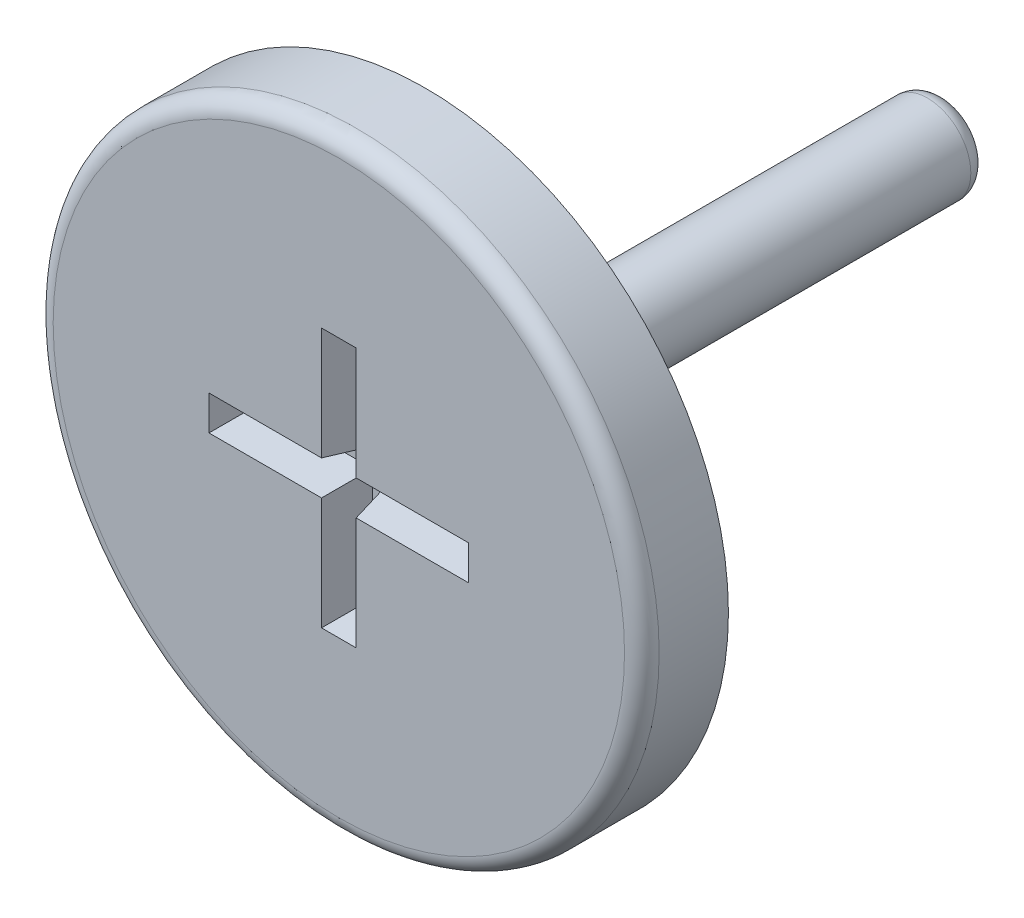
ISO-10303-21;
HEADER;
FILE_DESCRIPTION(('STEP AP214'),'2;1');
FILE_NAME('part.step','',(''),(''),'','','');
FILE_SCHEMA(('AUTOMOTIVE_DESIGN { 1 0 10303 214 1 1 1 1 }'));
ENDSEC;
DATA;
#1=APPLICATION_CONTEXT('core data for automotive mechanical design processes');
#2=APPLICATION_PROTOCOL_DEFINITION('international standard','automotive_design',2000,#1);
#3=PRODUCT_CONTEXT('',#1,'mechanical');
#4=PRODUCT('Part','Part','',(#3));
#5=PRODUCT_RELATED_PRODUCT_CATEGORY('part','',(#4));
#6=PRODUCT_DEFINITION_FORMATION('','',#4);
#7=PRODUCT_DEFINITION_CONTEXT('part definition',#1,'design');
#8=PRODUCT_DEFINITION('design','',#6,#7);
#9=PRODUCT_DEFINITION_SHAPE('','',#8);
#10=(LENGTH_UNIT() NAMED_UNIT(*) SI_UNIT(.MILLI.,.METRE.));
#11=(NAMED_UNIT(*) PLANE_ANGLE_UNIT() SI_UNIT($,.RADIAN.));
#12=(NAMED_UNIT(*) SI_UNIT($,.STERADIAN.) SOLID_ANGLE_UNIT());
#13=UNCERTAINTY_MEASURE_WITH_UNIT(LENGTH_MEASURE(1.E-05),#10,'distance_accuracy_value','');
#14=(GEOMETRIC_REPRESENTATION_CONTEXT(3) GLOBAL_UNCERTAINTY_ASSIGNED_CONTEXT((#13)) GLOBAL_UNIT_ASSIGNED_CONTEXT((#10,
#11,#12)) REPRESENTATION_CONTEXT('',''));
#15=CARTESIAN_POINT('',(0.,0.,0.));
#16=DIRECTION('',(0.,0.,1.));
#17=DIRECTION('',(1.,0.,0.));
#18=AXIS2_PLACEMENT_3D('',#15,#16,#17);
#19=CARTESIAN_POINT('',(0.,0.,-5.8));
#20=DIRECTION('',(0.,0.,-1.));
#21=DIRECTION('',(-1.,0.,0.));
#22=AXIS2_PLACEMENT_3D('',#19,#20,#21);
#23=TOROIDAL_SURFACE('',#22,0.3,0.2);
#24=CARTESIAN_POINT('',(0.,0.,-6.));
#25=DIRECTION('',(0.,0.,-1.));
#26=DIRECTION('',(-1.,0.,0.));
#27=AXIS2_PLACEMENT_3D('',#24,#25,#26);
#28=CIRCLE('',#27,0.3);
#29=CARTESIAN_POINT('',(-0.3,0.,-6.));
#30=VERTEX_POINT('',#29);
#31=EDGE_CURVE('E47',#30,#30,#28,.T.);
#32=ORIENTED_EDGE('',*,*,#31,.F.);
#33=EDGE_LOOP('',(#32));
#34=FACE_BOUND('',#33,.T.);
#35=CARTESIAN_POINT('',(0.,0.,-5.8));
#36=DIRECTION('',(0.,0.,-1.));
#37=DIRECTION('',(-1.,0.,0.));
#38=AXIS2_PLACEMENT_3D('',#35,#36,#37);
#39=CIRCLE('',#38,0.5);
#40=CARTESIAN_POINT('',(-0.5,0.,-5.8));
#41=VERTEX_POINT('',#40);
#42=EDGE_CURVE('E11',#41,#41,#39,.F.);
#43=ORIENTED_EDGE('',*,*,#42,.F.);
#44=EDGE_LOOP('',(#43));
#45=FACE_BOUND('',#44,.T.);
#46=ADVANCED_FACE('F39',(#34,#45),#23,.T.);
#47=CARTESIAN_POINT('',(0.,0.,0.8));
#48=DIRECTION('',(0.,0.,1.));
#49=DIRECTION('',(1.,0.,0.));
#50=AXIS2_PLACEMENT_3D('',#47,#48,#49);
#51=TOROIDAL_SURFACE('',#50,3.3,0.2);
#52=CARTESIAN_POINT('',(0.,0.,1.));
#53=DIRECTION('',(0.,0.,1.));
#54=DIRECTION('',(1.,0.,0.));
#55=AXIS2_PLACEMENT_3D('',#52,#53,#54);
#56=CIRCLE('',#55,3.3);
#57=CARTESIAN_POINT('',(3.3,0.,1.));
#58=VERTEX_POINT('',#57);
#59=EDGE_CURVE('E275',#58,#58,#56,.T.);
#60=ORIENTED_EDGE('',*,*,#59,.F.);
#61=EDGE_LOOP('',(#60));
#62=FACE_BOUND('',#61,.T.);
#63=CARTESIAN_POINT('',(0.,0.,0.8));
#64=DIRECTION('',(0.,0.,1.));
#65=DIRECTION('',(1.,0.,0.));
#66=AXIS2_PLACEMENT_3D('',#63,#64,#65);
#67=CIRCLE('',#66,3.5);
#68=CARTESIAN_POINT('',(3.5,0.,0.8));
#69=VERTEX_POINT('',#68);
#70=EDGE_CURVE('E279',#69,#69,#67,.F.);
#71=ORIENTED_EDGE('',*,*,#70,.F.);
#72=EDGE_LOOP('',(#71));
#73=FACE_BOUND('',#72,.T.);
#74=ADVANCED_FACE('F290',(#62,#73),#51,.T.);
#75=CARTESIAN_POINT('',(0.,0.,1.));
#76=DIRECTION('',(0.,0.,-1.));
#77=DIRECTION('',(-1.,0.,0.));
#78=AXIS2_PLACEMENT_3D('',#75,#76,#77);
#79=CYLINDRICAL_SURFACE('',#78,3.5);
#80=ORIENTED_EDGE('',*,*,#70,.T.);
#81=EDGE_LOOP('',(#80));
#82=FACE_BOUND('',#81,.T.);
#83=CARTESIAN_POINT('',(0.,0.,0.));
#84=DIRECTION('',(0.,0.,1.));
#85=DIRECTION('',(1.,0.,0.));
#86=AXIS2_PLACEMENT_3D('',#83,#84,#85);
#87=CIRCLE('',#86,3.5);
#88=CARTESIAN_POINT('',(3.5,0.,0.));
#89=VERTEX_POINT('',#88);
#90=EDGE_CURVE('E196',#89,#89,#87,.T.);
#91=ORIENTED_EDGE('',*,*,#90,.T.);
#92=EDGE_LOOP('',(#91));
#93=FACE_BOUND('',#92,.T.);
#94=ADVANCED_FACE('F305',(#82,#93),#79,.T.);
#95=CARTESIAN_POINT('',(0.,0.,1.));
#96=DIRECTION('',(0.,0.,1.));
#97=DIRECTION('',(1.,0.,0.));
#98=AXIS2_PLACEMENT_3D('',#95,#96,#97);
#99=PLANE('',#98);
#100=DIRECTION('',(0.,-1.,0.));
#101=VECTOR('',#100,1.);
#102=CARTESIAN_POINT('',(-1.5,-0.2,1.));
#103=LINE('',#102,#101);
#104=CARTESIAN_POINT('',(-1.5,0.2,1.));
#105=VERTEX_POINT('',#104);
#106=CARTESIAN_POINT('',(-1.5,-0.2,1.));
#107=VERTEX_POINT('',#106);
#108=EDGE_CURVE('E54',#105,#107,#103,.T.);
#109=ORIENTED_EDGE('',*,*,#108,.F.);
#110=DIRECTION('',(-1.,0.,0.));
#111=VECTOR('',#110,1.);
#112=CARTESIAN_POINT('',(-1.5,0.2,1.));
#113=LINE('',#112,#111);
#114=CARTESIAN_POINT('',(-0.2,0.2,1.));
#115=VERTEX_POINT('',#114);
#116=EDGE_CURVE('E190',#115,#105,#113,.T.);
#117=ORIENTED_EDGE('',*,*,#116,.F.);
#118=DIRECTION('',(0.,-1.,0.));
#119=VECTOR('',#118,1.);
#120=CARTESIAN_POINT('',(-0.2,1.5,1.));
#121=LINE('',#120,#119);
#122=CARTESIAN_POINT('',(-0.2,1.5,1.));
#123=VERTEX_POINT('',#122);
#124=EDGE_CURVE('E187',#123,#115,#121,.T.);
#125=ORIENTED_EDGE('',*,*,#124,.F.);
#126=DIRECTION('',(-1.,0.,0.));
#127=VECTOR('',#126,1.);
#128=CARTESIAN_POINT('',(-0.2,1.5,1.));
#129=LINE('',#128,#127);
#130=CARTESIAN_POINT('',(0.2,1.5,1.));
#131=VERTEX_POINT('',#130);
#132=EDGE_CURVE('E183',#131,#123,#129,.T.);
#133=ORIENTED_EDGE('',*,*,#132,.F.);
#134=DIRECTION('',(0.,1.,0.));
#135=VECTOR('',#134,1.);
#136=CARTESIAN_POINT('',(0.2,1.5,1.));
#137=LINE('',#136,#135);
#138=CARTESIAN_POINT('',(0.2,0.2,1.));
#139=VERTEX_POINT('',#138);
#140=EDGE_CURVE('E179',#139,#131,#137,.T.);
#141=ORIENTED_EDGE('',*,*,#140,.F.);
#142=DIRECTION('',(-1.,0.,0.));
#143=VECTOR('',#142,1.);
#144=CARTESIAN_POINT('',(0.2,0.2,1.));
#145=LINE('',#144,#143);
#146=CARTESIAN_POINT('',(1.5,0.2,1.));
#147=VERTEX_POINT('',#146);
#148=EDGE_CURVE('E175',#147,#139,#145,.T.);
#149=ORIENTED_EDGE('',*,*,#148,.F.);
#150=DIRECTION('',(0.,1.,0.));
#151=VECTOR('',#150,1.);
#152=CARTESIAN_POINT('',(1.5,-0.2,1.));
#153=LINE('',#152,#151);
#154=CARTESIAN_POINT('',(1.5,-0.2,1.));
#155=VERTEX_POINT('',#154);
#156=EDGE_CURVE('E171',#155,#147,#153,.T.);
#157=ORIENTED_EDGE('',*,*,#156,.F.);
#158=DIRECTION('',(1.,0.,0.));
#159=VECTOR('',#158,1.);
#160=CARTESIAN_POINT('',(0.2,-0.2,1.));
#161=LINE('',#160,#159);
#162=CARTESIAN_POINT('',(0.2,-0.2,1.));
#163=VERTEX_POINT('',#162);
#164=EDGE_CURVE('E167',#163,#155,#161,.T.);
#165=ORIENTED_EDGE('',*,*,#164,.F.);
#166=DIRECTION('',(0.,1.,0.));
#167=VECTOR('',#166,1.);
#168=CARTESIAN_POINT('',(0.2,-0.2,1.));
#169=LINE('',#168,#167);
#170=CARTESIAN_POINT('',(0.2,-1.5,1.));
#171=VERTEX_POINT('',#170);
#172=EDGE_CURVE('E160',#171,#163,#169,.T.);
#173=ORIENTED_EDGE('',*,*,#172,.F.);
#174=DIRECTION('',(1.,0.,0.));
#175=VECTOR('',#174,1.);
#176=CARTESIAN_POINT('',(-0.2,-1.5,1.));
#177=LINE('',#176,#175);
#178=CARTESIAN_POINT('',(-0.2,-1.5,1.));
#179=VERTEX_POINT('',#178);
#180=EDGE_CURVE('E156',#179,#171,#177,.T.);
#181=ORIENTED_EDGE('',*,*,#180,.F.);
#182=DIRECTION('',(0.,-1.,0.));
#183=VECTOR('',#182,1.);
#184=CARTESIAN_POINT('',(-0.2,-0.2,1.));
#185=LINE('',#184,#183);
#186=CARTESIAN_POINT('',(-0.2,-0.2,1.));
#187=VERTEX_POINT('',#186);
#188=EDGE_CURVE('E137',#187,#179,#185,.T.);
#189=ORIENTED_EDGE('',*,*,#188,.F.);
#190=DIRECTION('',(1.,0.,0.));
#191=VECTOR('',#190,1.);
#192=CARTESIAN_POINT('',(-1.5,-0.2,1.));
#193=LINE('',#192,#191);
#194=EDGE_CURVE('E147',#107,#187,#193,.T.);
#195=ORIENTED_EDGE('',*,*,#194,.F.);
#196=EDGE_LOOP('',(#109,#117,#125,#133,#141,#149,#157,#165,#173,#181,#189,#195));
#197=FACE_BOUND('',#196,.T.);
#198=ORIENTED_EDGE('',*,*,#59,.T.);
#199=EDGE_LOOP('',(#198));
#200=FACE_BOUND('',#199,.T.);
#201=ADVANCED_FACE('F152',(#197,#200),#99,.T.);
#202=CARTESIAN_POINT('',(0.,0.,0.));
#203=DIRECTION('',(0.,0.,1.));
#204=DIRECTION('',(1.,0.,0.));
#205=AXIS2_PLACEMENT_3D('',#202,#203,#204);
#206=PLANE('',#205);
#207=CARTESIAN_POINT('',(0.,0.,0.));
#208=DIRECTION('',(0.,0.,1.));
#209=DIRECTION('',(1.,0.,0.));
#210=AXIS2_PLACEMENT_3D('',#207,#208,#209);
#211=CIRCLE('',#210,0.5);
#212=CARTESIAN_POINT('',(0.5,0.,0.));
#213=VERTEX_POINT('',#212);
#214=EDGE_CURVE('E271',#213,#213,#211,.F.);
#215=ORIENTED_EDGE('',*,*,#214,.F.);
#216=EDGE_LOOP('',(#215));
#217=FACE_BOUND('',#216,.T.);
#218=ORIENTED_EDGE('',*,*,#90,.F.);
#219=EDGE_LOOP('',(#218));
#220=FACE_BOUND('',#219,.T.);
#221=ADVANCED_FACE('F296',(#217,#220),#206,.F.);
#222=CARTESIAN_POINT('',(0.,0.,-6.));
#223=DIRECTION('',(0.,0.,1.));
#224=DIRECTION('',(1.,0.,0.));
#225=AXIS2_PLACEMENT_3D('',#222,#223,#224);
#226=CYLINDRICAL_SURFACE('',#225,0.5);
#227=ORIENTED_EDGE('',*,*,#42,.T.);
#228=EDGE_LOOP('',(#227));
#229=FACE_BOUND('',#228,.T.);
#230=ORIENTED_EDGE('',*,*,#214,.T.);
#231=EDGE_LOOP('',(#230));
#232=FACE_BOUND('',#231,.T.);
#233=ADVANCED_FACE('F293',(#229,#232),#226,.T.);
#234=CARTESIAN_POINT('',(0.,0.,-6.));
#235=DIRECTION('',(0.,0.,-1.));
#236=DIRECTION('',(-1.,0.,0.));
#237=AXIS2_PLACEMENT_3D('',#234,#235,#236);
#238=PLANE('',#237);
#239=ORIENTED_EDGE('',*,*,#31,.T.);
#240=EDGE_LOOP('',(#239));
#241=FACE_BOUND('',#240,.T.);
#242=ADVANCED_FACE('F286',(#241),#238,.T.);
#243=CARTESIAN_POINT('',(-1.5,-0.2,1.));
#244=DIRECTION('',(-0.984807753012208,0.,-0.173648177666931));
#245=DIRECTION('',(-0.173648177666931,0.,0.984807753012208));
#246=AXIS2_PLACEMENT_3D('',#243,#244,#245);
#247=PLANE('',#246);
#248=ORIENTED_EDGE('',*,*,#108,.T.);
#249=DIRECTION('',(-0.171087869746036,-0.171087869746036,0.970287525247814));
#250=VECTOR('',#249,1.);
#251=CARTESIAN_POINT('',(-1.5,-0.2,1.));
#252=LINE('',#251,#250);
#253=CARTESIAN_POINT('',(-1.41183650964577,-0.111836509645767,0.5));
#254=VERTEX_POINT('',#253);
#255=EDGE_CURVE('E97',#254,#107,#252,.T.);
#256=ORIENTED_EDGE('',*,*,#255,.F.);
#257=DIRECTION('',(0.,-1.,0.));
#258=VECTOR('',#257,1.);
#259=CARTESIAN_POINT('',(-1.41183650964577,-0.2,0.5));
#260=LINE('',#259,#258);
#261=CARTESIAN_POINT('',(-1.41183650964577,0.111836509645767,0.5));
#262=VERTEX_POINT('',#261);
#263=EDGE_CURVE('E193',#262,#254,#260,.T.);
#264=ORIENTED_EDGE('',*,*,#263,.F.);
#265=DIRECTION('',(-0.171087869746036,0.171087869746036,0.970287525247814));
#266=VECTOR('',#265,1.);
#267=CARTESIAN_POINT('',(-1.5,0.2,1.));
#268=LINE('',#267,#266);
#269=EDGE_CURVE('E62',#262,#105,#268,.T.);
#270=ORIENTED_EDGE('',*,*,#269,.T.);
#271=EDGE_LOOP('',(#248,#256,#264,#270));
#272=FACE_BOUND('',#271,.T.);
#273=ADVANCED_FACE('F318',(#272),#247,.F.);
#274=CARTESIAN_POINT('',(-1.5,0.2,1.));
#275=DIRECTION('',(0.,0.984807753012208,-0.173648177666931));
#276=DIRECTION('',(0.,0.173648177666931,0.984807753012208));
#277=AXIS2_PLACEMENT_3D('',#274,#275,#276);
#278=PLANE('',#277);
#279=ORIENTED_EDGE('',*,*,#116,.T.);
#280=ORIENTED_EDGE('',*,*,#269,.F.);
#281=DIRECTION('',(-1.,0.,0.));
#282=VECTOR('',#281,1.);
#283=CARTESIAN_POINT('',(-1.5,0.111836509645767,0.5));
#284=LINE('',#283,#282);
#285=CARTESIAN_POINT('',(-0.111836509645767,0.111836509645767,0.5));
#286=VERTEX_POINT('',#285);
#287=EDGE_CURVE('E198',#286,#262,#284,.T.);
#288=ORIENTED_EDGE('',*,*,#287,.F.);
#289=DIRECTION('',(-0.171087869746036,0.171087869746036,0.970287525247814));
#290=VECTOR('',#289,1.);
#291=CARTESIAN_POINT('',(-0.238052376926507,0.238052376926508,1.21580575345654));
#292=LINE('',#291,#290);
#293=EDGE_CURVE('E102',#286,#115,#292,.T.);
#294=ORIENTED_EDGE('',*,*,#293,.T.);
#295=EDGE_LOOP('',(#279,#280,#288,#294));
#296=FACE_BOUND('',#295,.T.);
#297=ADVANCED_FACE('F319',(#296),#278,.F.);
#298=CARTESIAN_POINT('',(-0.2,1.5,1.));
#299=DIRECTION('',(-0.984807753012208,0.,-0.173648177666931));
#300=DIRECTION('',(-0.173648177666931,0.,0.984807753012208));
#301=AXIS2_PLACEMENT_3D('',#298,#299,#300);
#302=PLANE('',#301);
#303=ORIENTED_EDGE('',*,*,#124,.T.);
#304=ORIENTED_EDGE('',*,*,#293,.F.);
#305=DIRECTION('',(0.,-1.,0.));
#306=VECTOR('',#305,1.);
#307=CARTESIAN_POINT('',(-0.111836509645768,1.5,0.5));
#308=LINE('',#307,#306);
#309=CARTESIAN_POINT('',(-0.111836509645768,1.41183650964577,0.5));
#310=VERTEX_POINT('',#309);
#311=EDGE_CURVE('E232',#310,#286,#308,.T.);
#312=ORIENTED_EDGE('',*,*,#311,.F.);
#313=DIRECTION('',(-0.171087869746036,0.171087869746036,0.970287525247814));
#314=VECTOR('',#313,1.);
#315=CARTESIAN_POINT('',(-0.2,1.5,1.));
#316=LINE('',#315,#314);
#317=EDGE_CURVE('E220',#310,#123,#316,.T.);
#318=ORIENTED_EDGE('',*,*,#317,.T.);
#319=EDGE_LOOP('',(#303,#304,#312,#318));
#320=FACE_BOUND('',#319,.T.);
#321=ADVANCED_FACE('F322',(#320),#302,.F.);
#322=CARTESIAN_POINT('',(-0.2,1.5,1.));
#323=DIRECTION('',(0.,0.984807753012208,-0.173648177666931));
#324=DIRECTION('',(0.,0.173648177666931,0.984807753012208));
#325=AXIS2_PLACEMENT_3D('',#322,#323,#324);
#326=PLANE('',#325);
#327=ORIENTED_EDGE('',*,*,#132,.T.);
#328=ORIENTED_EDGE('',*,*,#317,.F.);
#329=DIRECTION('',(-1.,0.,0.));
#330=VECTOR('',#329,1.);
#331=CARTESIAN_POINT('',(-0.2,1.41183650964577,0.5));
#332=LINE('',#331,#330);
#333=CARTESIAN_POINT('',(0.111836509645767,1.41183650964577,0.5));
#334=VERTEX_POINT('',#333);
#335=EDGE_CURVE('E236',#334,#310,#332,.T.);
#336=ORIENTED_EDGE('',*,*,#335,.F.);
#337=DIRECTION('',(0.171087869746036,0.171087869746036,0.970287525247814));
#338=VECTOR('',#337,1.);
#339=CARTESIAN_POINT('',(0.2,1.5,1.));
#340=LINE('',#339,#338);
#341=EDGE_CURVE('E217',#334,#131,#340,.T.);
#342=ORIENTED_EDGE('',*,*,#341,.T.);
#343=EDGE_LOOP('',(#327,#328,#336,#342));
#344=FACE_BOUND('',#343,.T.);
#345=ADVANCED_FACE('F325',(#344),#326,.F.);
#346=CARTESIAN_POINT('',(0.2,1.5,1.));
#347=DIRECTION('',(0.984807753012208,0.,-0.173648177666931));
#348=DIRECTION('',(-0.173648177666931,0.,-0.984807753012208));
#349=AXIS2_PLACEMENT_3D('',#346,#347,#348);
#350=PLANE('',#349);
#351=ORIENTED_EDGE('',*,*,#140,.T.);
#352=ORIENTED_EDGE('',*,*,#341,.F.);
#353=DIRECTION('',(0.,1.,0.));
#354=VECTOR('',#353,1.);
#355=CARTESIAN_POINT('',(0.111836509645767,1.5,0.5));
#356=LINE('',#355,#354);
#357=CARTESIAN_POINT('',(0.111836509645767,0.111836509645767,0.5));
#358=VERTEX_POINT('',#357);
#359=EDGE_CURVE('E240',#358,#334,#356,.T.);
#360=ORIENTED_EDGE('',*,*,#359,.F.);
#361=DIRECTION('',(0.171087869746036,0.171087869746036,0.970287525247814));
#362=VECTOR('',#361,1.);
#363=CARTESIAN_POINT('',(0.238052376926508,0.238052376926508,1.21580575345654));
#364=LINE('',#363,#362);
#365=EDGE_CURVE('E214',#358,#139,#364,.T.);
#366=ORIENTED_EDGE('',*,*,#365,.T.);
#367=EDGE_LOOP('',(#351,#352,#360,#366));
#368=FACE_BOUND('',#367,.T.);
#369=ADVANCED_FACE('F329',(#368),#350,.F.);
#370=CARTESIAN_POINT('',(0.2,0.2,1.));
#371=DIRECTION('',(0.,0.984807753012208,-0.173648177666931));
#372=DIRECTION('',(0.,0.173648177666931,0.984807753012208));
#373=AXIS2_PLACEMENT_3D('',#370,#371,#372);
#374=PLANE('',#373);
#375=ORIENTED_EDGE('',*,*,#148,.T.);
#376=ORIENTED_EDGE('',*,*,#365,.F.);
#377=DIRECTION('',(-1.,0.,0.));
#378=VECTOR('',#377,1.);
#379=CARTESIAN_POINT('',(0.2,0.111836509645767,0.5));
#380=LINE('',#379,#378);
#381=CARTESIAN_POINT('',(1.41183650964577,0.111836509645767,0.5));
#382=VERTEX_POINT('',#381);
#383=EDGE_CURVE('E244',#382,#358,#380,.T.);
#384=ORIENTED_EDGE('',*,*,#383,.F.);
#385=DIRECTION('',(0.171087869746036,0.171087869746036,0.970287525247814));
#386=VECTOR('',#385,1.);
#387=CARTESIAN_POINT('',(1.48829157633031,0.188291576330305,0.933598229705679));
#388=LINE('',#387,#386);
#389=EDGE_CURVE('E211',#382,#147,#388,.T.);
#390=ORIENTED_EDGE('',*,*,#389,.T.);
#391=EDGE_LOOP('',(#375,#376,#384,#390));
#392=FACE_BOUND('',#391,.T.);
#393=ADVANCED_FACE('F333',(#392),#374,.F.);
#394=CARTESIAN_POINT('',(1.5,-0.2,1.));
#395=DIRECTION('',(0.984807753012208,0.,-0.173648177666931));
#396=DIRECTION('',(-0.173648177666931,0.,-0.984807753012208));
#397=AXIS2_PLACEMENT_3D('',#394,#395,#396);
#398=PLANE('',#397);
#399=ORIENTED_EDGE('',*,*,#156,.T.);
#400=ORIENTED_EDGE('',*,*,#389,.F.);
#401=DIRECTION('',(0.,1.,0.));
#402=VECTOR('',#401,1.);
#403=CARTESIAN_POINT('',(1.41183650964577,-0.2,0.5));
#404=LINE('',#403,#402);
#405=CARTESIAN_POINT('',(1.41183650964577,-0.111836509645767,0.5));
#406=VERTEX_POINT('',#405);
#407=EDGE_CURVE('E248',#406,#382,#404,.T.);
#408=ORIENTED_EDGE('',*,*,#407,.F.);
#409=DIRECTION('',(0.171087869746036,-0.171087869746036,0.970287525247814));
#410=VECTOR('',#409,1.);
#411=CARTESIAN_POINT('',(1.46194762307349,-0.161947623073493,0.784194246543458));
#412=LINE('',#411,#410);
#413=EDGE_CURVE('E208',#406,#155,#412,.T.);
#414=ORIENTED_EDGE('',*,*,#413,.T.);
#415=EDGE_LOOP('',(#399,#400,#408,#414));
#416=FACE_BOUND('',#415,.T.);
#417=ADVANCED_FACE('F337',(#416),#398,.F.);
#418=CARTESIAN_POINT('',(0.2,-0.2,1.));
#419=DIRECTION('',(0.,-0.984807753012208,-0.173648177666931));
#420=DIRECTION('',(0.,0.173648177666931,-0.984807753012208));
#421=AXIS2_PLACEMENT_3D('',#418,#419,#420);
#422=PLANE('',#421);
#423=ORIENTED_EDGE('',*,*,#164,.T.);
#424=ORIENTED_EDGE('',*,*,#413,.F.);
#425=DIRECTION('',(1.,0.,0.));
#426=VECTOR('',#425,1.);
#427=CARTESIAN_POINT('',(0.2,-0.111836509645767,0.5));
#428=LINE('',#427,#426);
#429=CARTESIAN_POINT('',(0.111836509645767,-0.111836509645767,0.5));
#430=VERTEX_POINT('',#429);
#431=EDGE_CURVE('E252',#430,#406,#428,.T.);
#432=ORIENTED_EDGE('',*,*,#431,.F.);
#433=DIRECTION('',(0.171087869746036,-0.171087869746036,0.970287525247814));
#434=VECTOR('',#433,1.);
#435=CARTESIAN_POINT('',(0.2,-0.2,1.));
#436=LINE('',#435,#434);
#437=EDGE_CURVE('E205',#430,#163,#436,.T.);
#438=ORIENTED_EDGE('',*,*,#437,.T.);
#439=EDGE_LOOP('',(#423,#424,#432,#438));
#440=FACE_BOUND('',#439,.T.);
#441=ADVANCED_FACE('F341',(#440),#422,.F.);
#442=CARTESIAN_POINT('',(0.2,-0.2,1.));
#443=DIRECTION('',(0.984807753012208,0.,-0.173648177666931));
#444=DIRECTION('',(-0.173648177666931,0.,-0.984807753012208));
#445=AXIS2_PLACEMENT_3D('',#442,#443,#444);
#446=PLANE('',#445);
#447=ORIENTED_EDGE('',*,*,#172,.T.);
#448=ORIENTED_EDGE('',*,*,#437,.F.);
#449=DIRECTION('',(0.,1.,0.));
#450=VECTOR('',#449,1.);
#451=CARTESIAN_POINT('',(0.111836509645767,-0.2,0.5));
#452=LINE('',#451,#450);
#453=CARTESIAN_POINT('',(0.111836509645768,-1.41183650964577,0.5));
#454=VERTEX_POINT('',#453);
#455=EDGE_CURVE('E256',#454,#430,#452,.T.);
#456=ORIENTED_EDGE('',*,*,#455,.F.);
#457=DIRECTION('',(0.171087869746036,-0.171087869746036,0.970287525247814));
#458=VECTOR('',#457,1.);
#459=CARTESIAN_POINT('',(0.188291576330306,-1.48829157633031,0.933598229705679));
#460=LINE('',#459,#458);
#461=EDGE_CURVE('E202',#454,#171,#460,.T.);
#462=ORIENTED_EDGE('',*,*,#461,.T.);
#463=EDGE_LOOP('',(#447,#448,#456,#462));
#464=FACE_BOUND('',#463,.T.);
#465=ADVANCED_FACE('F345',(#464),#446,.F.);
#466=CARTESIAN_POINT('',(-0.2,-1.5,1.));
#467=DIRECTION('',(0.,-0.984807753012208,-0.173648177666931));
#468=DIRECTION('',(0.,0.173648177666931,-0.984807753012208));
#469=AXIS2_PLACEMENT_3D('',#466,#467,#468);
#470=PLANE('',#469);
#471=ORIENTED_EDGE('',*,*,#180,.T.);
#472=ORIENTED_EDGE('',*,*,#461,.F.);
#473=DIRECTION('',(1.,0.,0.));
#474=VECTOR('',#473,1.);
#475=CARTESIAN_POINT('',(-0.2,-1.41183650964577,0.5));
#476=LINE('',#475,#474);
#477=CARTESIAN_POINT('',(-0.111836509645767,-1.41183650964577,0.5));
#478=VERTEX_POINT('',#477);
#479=EDGE_CURVE('E260',#478,#454,#476,.T.);
#480=ORIENTED_EDGE('',*,*,#479,.F.);
#481=DIRECTION('',(-0.171087869746036,-0.171087869746036,0.970287525247814));
#482=VECTOR('',#481,1.);
#483=CARTESIAN_POINT('',(-0.161947623073492,-1.46194762307349,0.784194246543458));
#484=LINE('',#483,#482);
#485=EDGE_CURVE('E144',#478,#179,#484,.T.);
#486=ORIENTED_EDGE('',*,*,#485,.T.);
#487=EDGE_LOOP('',(#471,#472,#480,#486));
#488=FACE_BOUND('',#487,.T.);
#489=ADVANCED_FACE('F349',(#488),#470,.F.);
#490=CARTESIAN_POINT('',(-0.2,-0.2,1.));
#491=DIRECTION('',(-0.984807753012208,0.,-0.173648177666931));
#492=DIRECTION('',(-0.173648177666931,0.,0.984807753012208));
#493=AXIS2_PLACEMENT_3D('',#490,#491,#492);
#494=PLANE('',#493);
#495=ORIENTED_EDGE('',*,*,#188,.T.);
#496=ORIENTED_EDGE('',*,*,#485,.F.);
#497=DIRECTION('',(0.,-1.,0.));
#498=VECTOR('',#497,1.);
#499=CARTESIAN_POINT('',(-0.111836509645767,-0.2,0.5));
#500=LINE('',#499,#498);
#501=CARTESIAN_POINT('',(-0.111836509645767,-0.111836509645767,0.5));
#502=VERTEX_POINT('',#501);
#503=EDGE_CURVE('E140',#502,#478,#500,.T.);
#504=ORIENTED_EDGE('',*,*,#503,.F.);
#505=DIRECTION('',(-0.171087869746036,-0.171087869746036,0.970287525247814));
#506=VECTOR('',#505,1.);
#507=CARTESIAN_POINT('',(-0.2,-0.2,1.));
#508=LINE('',#507,#506);
#509=EDGE_CURVE('E133',#502,#187,#508,.T.);
#510=ORIENTED_EDGE('',*,*,#509,.T.);
#511=EDGE_LOOP('',(#495,#496,#504,#510));
#512=FACE_BOUND('',#511,.T.);
#513=ADVANCED_FACE('F135',(#512),#494,.F.);
#514=CARTESIAN_POINT('',(-1.5,-0.2,1.));
#515=DIRECTION('',(0.,-0.984807753012208,-0.173648177666931));
#516=DIRECTION('',(0.,0.173648177666931,-0.984807753012208));
#517=AXIS2_PLACEMENT_3D('',#514,#515,#516);
#518=PLANE('',#517);
#519=ORIENTED_EDGE('',*,*,#194,.T.);
#520=ORIENTED_EDGE('',*,*,#509,.F.);
#521=DIRECTION('',(1.,0.,0.));
#522=VECTOR('',#521,1.);
#523=CARTESIAN_POINT('',(-1.5,-0.111836509645767,0.5));
#524=LINE('',#523,#522);
#525=EDGE_CURVE('E228',#254,#502,#524,.T.);
#526=ORIENTED_EDGE('',*,*,#525,.F.);
#527=ORIENTED_EDGE('',*,*,#255,.T.);
#528=EDGE_LOOP('',(#519,#520,#526,#527));
#529=FACE_BOUND('',#528,.T.);
#530=ADVANCED_FACE('F148',(#529),#518,.F.);
#531=CARTESIAN_POINT('',(0.,0.,0.5));
#532=DIRECTION('',(0.,0.,-1.));
#533=DIRECTION('',(-1.,0.,0.));
#534=AXIS2_PLACEMENT_3D('',#531,#532,#533);
#535=PLANE('',#534);
#536=ORIENTED_EDGE('',*,*,#263,.T.);
#537=ORIENTED_EDGE('',*,*,#525,.T.);
#538=ORIENTED_EDGE('',*,*,#503,.T.);
#539=ORIENTED_EDGE('',*,*,#479,.T.);
#540=ORIENTED_EDGE('',*,*,#455,.T.);
#541=ORIENTED_EDGE('',*,*,#431,.T.);
#542=ORIENTED_EDGE('',*,*,#407,.T.);
#543=ORIENTED_EDGE('',*,*,#383,.T.);
#544=ORIENTED_EDGE('',*,*,#359,.T.);
#545=ORIENTED_EDGE('',*,*,#335,.T.);
#546=ORIENTED_EDGE('',*,*,#311,.T.);
#547=ORIENTED_EDGE('',*,*,#287,.T.);
#548=EDGE_LOOP('',(#536,#537,#538,#539,#540,#541,#542,#543,#544,#545,#546,#547));
#549=FACE_BOUND('',#548,.T.);
#550=ADVANCED_FACE('F358',(#549),#535,.F.);
#551=CLOSED_SHELL('',(#46,#74,#94,#201,#221,#233,#242,#273,#297,#321,#345,#369,#393,#417,#441,
#465,#489,#513,#530,#550));
#552=MANIFOLD_SOLID_BREP('B2',#551);
#553=ADVANCED_BREP_SHAPE_REPRESENTATION('',(#18,#552),#14);
#554=SHAPE_DEFINITION_REPRESENTATION(#9,#553);
ENDSEC;
END-ISO-10303-21;
